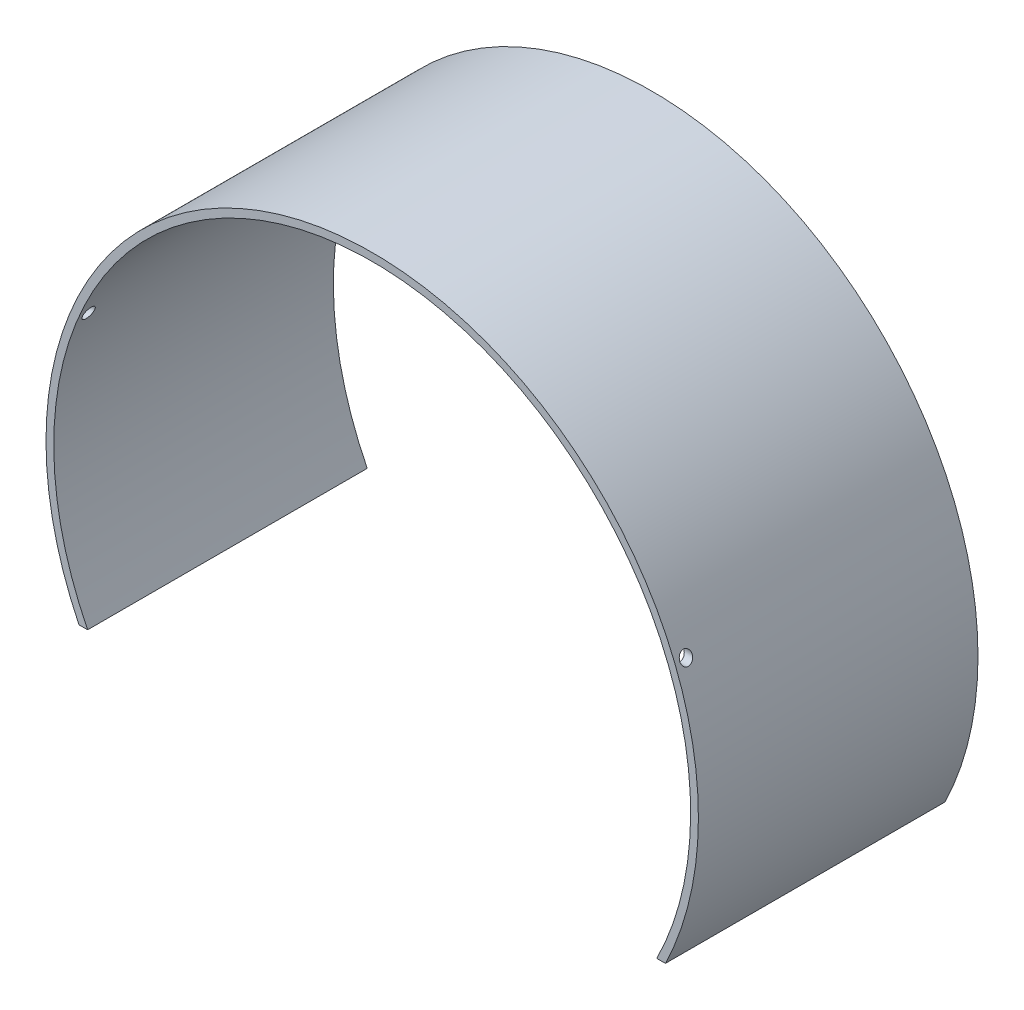
ISO-10303-21;
HEADER;
FILE_DESCRIPTION(('STEP AP214'),'2;1');
FILE_NAME('part.step','',(''),(''),'','','');
FILE_SCHEMA(('AUTOMOTIVE_DESIGN { 1 0 10303 214 1 1 1 1 }'));
ENDSEC;
DATA;
#1=APPLICATION_CONTEXT('core data for automotive mechanical design processes');
#2=APPLICATION_PROTOCOL_DEFINITION('international standard','automotive_design',2000,#1);
#3=PRODUCT_CONTEXT('',#1,'mechanical');
#4=PRODUCT('Part','Part','',(#3));
#5=PRODUCT_RELATED_PRODUCT_CATEGORY('part','',(#4));
#6=PRODUCT_DEFINITION_FORMATION('','',#4);
#7=PRODUCT_DEFINITION_CONTEXT('part definition',#1,'design');
#8=PRODUCT_DEFINITION('design','',#6,#7);
#9=PRODUCT_DEFINITION_SHAPE('','',#8);
#10=(LENGTH_UNIT() NAMED_UNIT(*) SI_UNIT(.MILLI.,.METRE.));
#11=(NAMED_UNIT(*) PLANE_ANGLE_UNIT() SI_UNIT($,.RADIAN.));
#12=(NAMED_UNIT(*) SI_UNIT($,.STERADIAN.) SOLID_ANGLE_UNIT());
#13=UNCERTAINTY_MEASURE_WITH_UNIT(LENGTH_MEASURE(1.E-05),#10,'distance_accuracy_value','');
#14=(GEOMETRIC_REPRESENTATION_CONTEXT(3) GLOBAL_UNCERTAINTY_ASSIGNED_CONTEXT((#13)) GLOBAL_UNIT_ASSIGNED_CONTEXT((#10,
#11,#12)) REPRESENTATION_CONTEXT('',''));
#15=CARTESIAN_POINT('',(0.,0.,0.));
#16=DIRECTION('',(0.,0.,1.));
#17=DIRECTION('',(1.,0.,0.));
#18=AXIS2_PLACEMENT_3D('',#15,#16,#17);
#19=CARTESIAN_POINT('',(183.196615689264,-92.0000000000001,389.75));
#20=DIRECTION('',(0.,1.,0.));
#21=DIRECTION('',(0.,0.,1.));
#22=AXIS2_PLACEMENT_3D('',#19,#20,#21);
#23=PLANE('',#22);
#24=DIRECTION('',(1.,0.,0.));
#25=VECTOR('',#24,1.);
#26=CARTESIAN_POINT('',(183.196615689264,-92.0000000000001,209.75));
#27=LINE('',#26,#25);
#28=CARTESIAN_POINT('',(183.196615689264,-92.0000000000001,209.75));
#29=VERTEX_POINT('',#28);
#30=CARTESIAN_POINT('',(188.77499834459,-92.0000000000002,209.75));
#31=VERTEX_POINT('',#30);
#32=EDGE_CURVE('E117',#29,#31,#27,.T.);
#33=ORIENTED_EDGE('',*,*,#32,.T.);
#34=DIRECTION('',(0.,0.,-1.));
#35=VECTOR('',#34,1.);
#36=CARTESIAN_POINT('',(188.77499834459,-92.0000000000002,389.75));
#37=LINE('',#36,#35);
#38=CARTESIAN_POINT('',(188.77499834459,-92.0000000000002,389.75));
#39=VERTEX_POINT('',#38);
#40=EDGE_CURVE('E11',#39,#31,#37,.T.);
#41=ORIENTED_EDGE('',*,*,#40,.F.);
#42=DIRECTION('',(1.,0.,0.));
#43=VECTOR('',#42,1.);
#44=CARTESIAN_POINT('',(183.196615689264,-92.0000000000001,389.75));
#45=LINE('',#44,#43);
#46=CARTESIAN_POINT('',(183.196615689264,-92.0000000000001,389.75));
#47=VERTEX_POINT('',#46);
#48=EDGE_CURVE('E92',#47,#39,#45,.T.);
#49=ORIENTED_EDGE('',*,*,#48,.F.);
#50=DIRECTION('',(0.,0.,-1.));
#51=VECTOR('',#50,1.);
#52=CARTESIAN_POINT('',(183.196615689264,-92.0000000000001,389.75));
#53=LINE('',#52,#51);
#54=EDGE_CURVE('E52',#47,#29,#53,.T.);
#55=ORIENTED_EDGE('',*,*,#54,.T.);
#56=EDGE_LOOP('',(#33,#41,#49,#55));
#57=FACE_BOUND('',#56,.T.);
#58=ADVANCED_FACE('F39',(#57),#23,.F.);
#59=CARTESIAN_POINT('',(0.,0.,389.75));
#60=DIRECTION('',(0.,0.,-1.));
#61=DIRECTION('',(-1.,0.,0.));
#62=AXIS2_PLACEMENT_3D('',#59,#60,#61);
#63=CYLINDRICAL_SURFACE('',#62,210.);
#64=CARTESIAN_POINT('',(-194.976921711263,77.9999999999998,378.75));
#65=CARTESIAN_POINT('',(-194.881142672388,78.2394176241366,378.750005201113));
#66=CARTESIAN_POINT('',(-194.784851609682,78.4788273444568,378.771526870039));
#67=CARTESIAN_POINT('',(-194.593935734282,78.9510299466546,378.857290996574));
#68=CARTESIAN_POINT('',(-194.499313505776,79.1838128597919,378.921594600757));
#69=CARTESIAN_POINT('',(-194.360918103973,79.5226293419747,379.049156961286));
#70=CARTESIAN_POINT('',(-194.315330547846,79.6339518551347,379.096927946436));
#71=CARTESIAN_POINT('',(-194.225708634616,79.8522885264413,379.202646509375));
#72=CARTESIAN_POINT('',(-194.181673659856,79.9593044003323,379.260589984154));
#73=CARTESIAN_POINT('',(-194.095535411539,80.1681726788096,379.386386379367));
#74=CARTESIAN_POINT('',(-194.053432280306,80.2700247030238,379.454240028367));
#75=CARTESIAN_POINT('',(-193.971574025036,80.4676326201603,379.599473979321));
#76=CARTESIAN_POINT('',(-193.931817790329,80.5633913984176,379.676849720577));
#77=CARTESIAN_POINT('',(-193.856407892729,80.7446742210524,379.837796605336));
#78=CARTESIAN_POINT('',(-193.820658568078,80.8304412494634,379.921049169495));
#79=CARTESIAN_POINT('',(-193.752088683813,80.994666776527,380.095510624695));
#80=CARTESIAN_POINT('',(-193.719266698525,81.0731288336775,380.186715599471));
#81=CARTESIAN_POINT('',(-193.656896462334,81.2219980645113,380.376546880967));
#82=CARTESIAN_POINT('',(-193.627348620902,81.2924042307452,380.475174113346));
#83=CARTESIAN_POINT('',(-193.571904072593,81.4243395714827,380.679097788599));
#84=CARTESIAN_POINT('',(-193.5460054403,81.4858734276482,380.784390671679));
#85=CARTESIAN_POINT('',(-193.500011403564,81.5950294003176,380.992586066739));
#86=CARTESIAN_POINT('',(-193.4796236238,81.6433556379105,381.095055289072));
#87=CARTESIAN_POINT('',(-193.442486580763,81.7313077430687,381.304244786342));
#88=CARTESIAN_POINT('',(-193.425735548229,81.7709378413687,381.410962964142));
#89=CARTESIAN_POINT('',(-193.396074294507,81.8410648670735,381.627855456227));
#90=CARTESIAN_POINT('',(-193.383163277795,81.8715636861862,381.738029049428));
#91=CARTESIAN_POINT('',(-193.361347952578,81.9230730794341,381.960960763958));
#92=CARTESIAN_POINT('',(-193.352443425654,81.9440841708041,382.073718744042));
#93=CARTESIAN_POINT('',(-193.339254445418,81.975197182781,382.292680466997));
#94=CARTESIAN_POINT('',(-193.334683438522,81.9859758059851,382.398771376333));
#95=CARTESIAN_POINT('',(-193.329148371212,81.9990270760377,382.611607367368));
#96=CARTESIAN_POINT('',(-193.328185515917,82.0012968809479,382.718352655708));
#97=CARTESIAN_POINT('',(-193.329881719032,81.9972977543902,382.931593544981));
#98=CARTESIAN_POINT('',(-193.332538739888,81.9910336264937,383.038089252607));
#99=CARTESIAN_POINT('',(-193.341440181146,81.970041099729,383.250129756368));
#100=CARTESIAN_POINT('',(-193.347685923304,81.9553095822486,383.355674187584));
#101=CARTESIAN_POINT('',(-193.363469731107,81.9180625461989,383.562077684767));
#102=CARTESIAN_POINT('',(-193.372911144231,81.8957755146518,383.662985337062));
#103=CARTESIAN_POINT('',(-193.39500971329,81.8435764919634,383.862460423829));
#104=CARTESIAN_POINT('',(-193.407668007906,81.8136618008432,383.961027016097));
#105=CARTESIAN_POINT('',(-193.450273896472,81.7128931446686,384.252163652002));
#106=CARTESIAN_POINT('',(-193.484867806969,81.6309785649149,384.44036750629));
#107=CARTESIAN_POINT('',(-193.566146255149,81.4380636154416,384.805120161454));
#108=CARTESIAN_POINT('',(-193.613137588048,81.3263242134224,384.981205115071));
#109=CARTESIAN_POINT('',(-193.716988481702,81.0786431946026,385.312164524876));
#110=CARTESIAN_POINT('',(-193.773850617128,80.9426952630776,385.467033428224));
#111=CARTESIAN_POINT('',(-193.899633032345,80.6409368791542,385.762123137858));
#112=CARTESIAN_POINT('',(-193.969102355083,80.4737453411596,385.900695624245));
#113=CARTESIAN_POINT('',(-194.114947661446,80.1213047780078,386.14800763883));
#114=CARTESIAN_POINT('',(-194.191325972669,79.9360496656895,386.256737062935));
#115=CARTESIAN_POINT('',(-194.354826233593,79.5377345074466,386.449723942606));
#116=CARTESIAN_POINT('',(-194.442323928921,79.3236311946809,386.531512760198));
#117=CARTESIAN_POINT('',(-194.620364250769,78.8858017302189,386.657336709786));
#118=CARTESIAN_POINT('',(-194.710907803923,78.6620726442141,386.701360242593));
#119=CARTESIAN_POINT('',(-194.897539667198,78.1985591915143,386.752221195849));
#120=CARTESIAN_POINT('',(-194.993665796349,77.9585556029542,386.756946523904));
#121=CARTESIAN_POINT('',(-195.184009199804,77.4807635367216,386.723381600682));
#122=CARTESIAN_POINT('',(-195.278226201372,77.2429753781281,386.685085246867));
#123=CARTESIAN_POINT('',(-195.462923022818,76.7744077564935,386.565349224868));
#124=CARTESIAN_POINT('',(-195.553363286069,76.5437070845793,386.48353780504));
#125=CARTESIAN_POINT('',(-195.726910570802,76.0988403603978,386.277833439571));
#126=CARTESIAN_POINT('',(-195.810018778985,75.8846716331198,386.153947319568));
#127=CARTESIAN_POINT('',(-195.963138927896,75.4883542471023,385.872246313331));
#128=CARTESIAN_POINT('',(-196.033534956521,75.3052831559748,385.715941374065));
#129=CARTESIAN_POINT('',(-196.162654248222,74.968297932966,385.370482035907));
#130=CARTESIAN_POINT('',(-196.221382519999,74.8143712913772,385.181341798082));
#131=CARTESIAN_POINT('',(-196.321489486172,74.5512663872162,384.789172710081));
#132=CARTESIAN_POINT('',(-196.363766055537,74.4397832895196,384.587919662631));
#133=CARTESIAN_POINT('',(-196.434690713109,74.252423501199,384.167254444403));
#134=CARTESIAN_POINT('',(-196.463344742107,74.1765312895803,383.947850238447));
#135=CARTESIAN_POINT('',(-196.504568867916,74.0672506562282,383.512070699953));
#136=CARTESIAN_POINT('',(-196.518037526864,74.0314883468818,383.296373396423));
#137=CARTESIAN_POINT('',(-196.53154666379,73.9956185212156,382.861635055153));
#138=CARTESIAN_POINT('',(-196.531590299738,73.9955026197822,382.642594815895));
#139=CARTESIAN_POINT('',(-196.518471572112,74.03033588563,382.214912549003));
#140=CARTESIAN_POINT('',(-196.505736743506,74.064149845954,382.006163474696));
#141=CARTESIAN_POINT('',(-196.468139753065,74.1638245426943,381.59762506648));
#142=CARTESIAN_POINT('',(-196.443277646107,74.2296851341011,381.397835692033));
#143=CARTESIAN_POINT('',(-196.381982743873,74.3916955594421,381.010889445688));
#144=CARTESIAN_POINT('',(-196.345455471559,74.4880926574939,380.823851405901));
#145=CARTESIAN_POINT('',(-196.262027799062,74.7076314098016,380.468794432983));
#146=CARTESIAN_POINT('',(-196.215126165889,74.8307762429886,380.300777764129));
#147=CARTESIAN_POINT('',(-196.11003520958,75.1057696227136,379.98054381049));
#148=CARTESIAN_POINT('',(-196.051443449062,75.2586341905078,379.829332456599));
#149=CARTESIAN_POINT('',(-195.926027635156,75.5845365611036,379.554532150932));
#150=CARTESIAN_POINT('',(-195.859199323463,75.7575847963796,379.430957581105));
#151=CARTESIAN_POINT('',(-195.714520642496,76.1306042804032,379.206594285297));
#152=CARTESIAN_POINT('',(-195.636238320565,76.3315903175498,379.107774247862));
#153=CARTESIAN_POINT('',(-195.474382967604,76.7451287346369,378.94545272178));
#154=CARTESIAN_POINT('',(-195.390814529047,76.9576710527619,378.881921032269));
#155=CARTESIAN_POINT('',(-195.251823299262,77.3094241330047,378.80760010628));
#156=CARTESIAN_POINT('',(-195.197362204936,77.4468322888159,378.786004982189));
#157=CARTESIAN_POINT('',(-195.087631844921,77.7228278239254,378.757203222643));
#158=CARTESIAN_POINT('',(-195.032362556685,77.8614152360773,378.749996989382));
#159=CARTESIAN_POINT('',(-194.976921711263,77.9999999999998,378.75));
#160=B_SPLINE_CURVE_WITH_KNOTS('',3,(#64,#65,#66,#67,#68,#69,#70,#71,#72,#73,#74,#75,#76,#77,
#78,#79,#80,#81,#82,#83,#84,#85,#86,#87,#88,#89,#90,#91,#92,#93,#94,#95,#96,#97,#98,#99,#100,
#101,#102,#103,#104,#105,#106,#107,#108,#109,#110,#111,#112,#113,#114,#115,#116,#117,#118,#119,
#120,#121,#122,#123,#124,#125,#126,#127,#128,#129,#130,#131,#132,#133,#134,#135,#136,#137,#138,
#139,#140,#141,#142,#143,#144,#145,#146,#147,#148,#149,#150,#151,#152,#153,#154,#155,#156,#157,
#158,#159),.UNSPECIFIED.,.T.,.F.,(4,2,2,2,2,2,2,2,2,2,2,2,2,2,2,2,2,2,2,2,2,2,2,2,2,2,2,2,2,2,2,
2,2,2,2,2,2,2,2,2,2,2,2,2,2,2,2,4),(0.,0.773084114651815,1.54727554920158,1.93517625847403,
2.32292086836418,2.71069399835494,3.09828211823903,3.47207342220481,3.84568167651744,
4.21933660239431,4.59279363407431,4.9376824887526,5.28240317865652,5.62705240400698,
5.97168283812283,6.29149272007331,6.61140940874959,6.93114609742438,7.25100062339306,
7.56193692327922,7.87298343910647,8.49448136285373,9.13309882680567,9.77188311693246,
10.4529533314922,11.1342538552361,11.8670128850764,12.5999968932516,13.3721365655025,
14.1443857780187,14.9233408954379,15.7021697058642,16.4506546708181,17.1988176306998,
17.8969258808102,18.5947294059009,19.2486271155422,19.9023710085427,20.5349481371912,
21.167522403486,21.8053557147744,22.4432648731834,23.1089383488064,23.7749574333933,
24.4836747468968,25.1917845798408,25.6392649411511,26.0867578101809),.UNSPECIFIED.);
#161=CARTESIAN_POINT('',(-194.976921711263,77.9999999999998,378.75));
#162=VERTEX_POINT('',#161);
#163=EDGE_CURVE('E106',#162,#162,#160,.T.);
#164=ORIENTED_EDGE('',*,*,#163,.T.);
#165=EDGE_LOOP('',(#164));
#166=FACE_BOUND('',#165,.T.);
#167=CARTESIAN_POINT('',(194.976921711263,77.9999999999998,378.75));
#168=CARTESIAN_POINT('',(195.071739103529,77.7629827940224,378.750008341797));
#169=CARTESIAN_POINT('',(195.16619155225,77.5256152307878,378.771111025675));
#170=CARTESIAN_POINT('',(195.351746518049,77.0568548158801,378.855477450002));
#171=CARTESIAN_POINT('',(195.442844703569,76.825469797184,378.918793818411));
#172=CARTESIAN_POINT('',(195.619173589421,76.375371743191,379.086894209028));
#173=CARTESIAN_POINT('',(195.70439576273,76.1566771937005,379.191737065146));
#174=CARTESIAN_POINT('',(195.866188657395,75.7395947053984,379.440991591055));
#175=CARTESIAN_POINT('',(195.942763242787,75.5411977007084,379.585385488499));
#176=CARTESIAN_POINT('',(196.081725138623,75.179738369808,379.90365867604));
#177=CARTESIAN_POINT('',(196.144572883844,75.0155428097419,380.076046762991));
#178=CARTESIAN_POINT('',(196.257787676374,74.7188467834507,380.449807452451));
#179=CARTESIAN_POINT('',(196.308159766375,74.5863335119196,380.6511682919));
#180=CARTESIAN_POINT('',(196.391508865999,74.366579571367,381.062165904988));
#181=CARTESIAN_POINT('',(196.425444857934,74.2768497525348,381.270277983162));
#182=CARTESIAN_POINT('',(196.479570463859,74.133557345892,381.700279462973));
#183=CARTESIAN_POINT('',(196.499765516395,74.0799804491323,381.922163375846));
#184=CARTESIAN_POINT('',(196.524904774281,74.0132622995728,382.359907775281));
#185=CARTESIAN_POINT('',(196.530643812969,73.9980137517791,382.575403752064));
#186=CARTESIAN_POINT('',(196.528992239273,74.0024001214686,383.00597074134));
#187=CARTESIAN_POINT('',(196.521603860048,74.022029105793,383.221041819884));
#188=CARTESIAN_POINT('',(196.49425912081,74.0945852487143,383.639932279777));
#189=CARTESIAN_POINT('',(196.474571162513,74.1468012677481,383.843893307963));
#190=CARTESIAN_POINT('',(196.423530560797,74.2819077554937,384.239815837077));
#191=CARTESIAN_POINT('',(196.392177367368,74.3647996705602,384.431776771709));
#192=CARTESIAN_POINT('',(196.318074771379,74.5602078572997,384.802456461768));
#193=CARTESIAN_POINT('',(196.275116174077,74.6732674065914,384.980846258714));
#194=CARTESIAN_POINT('',(196.179387073392,74.9244026314206,385.316045554657));
#195=CARTESIAN_POINT('',(196.126614603631,75.0624833202313,385.472850717826));
#196=CARTESIAN_POINT('',(196.009777439476,75.3670686141398,385.769119323256));
#197=CARTESIAN_POINT('',(195.945272987463,75.5346663972325,385.907284179418));
#198=CARTESIAN_POINT('',(195.808770974093,75.8878188543834,386.153688214243));
#199=CARTESIAN_POINT('',(195.736771269916,76.0733786625389,386.261918802474));
#200=CARTESIAN_POINT('',(195.582144335651,76.4700789536334,386.452823593028));
#201=CARTESIAN_POINT('',(195.499129829853,76.6820989463912,386.533357197598));
#202=CARTESIAN_POINT('',(195.328760818731,77.115039815053,386.65737764305));
#203=CARTESIAN_POINT('',(195.241405019085,77.3359633417179,386.700853364439));
#204=CARTESIAN_POINT('',(195.059442183209,77.7938173232741,386.751685695812));
#205=CARTESIAN_POINT('',(194.964705526998,78.030942794384,386.756844064007));
#206=CARTESIAN_POINT('',(194.775336322718,78.5024395207821,386.725355089931));
#207=CARTESIAN_POINT('',(194.680703801874,78.7368101638666,386.688698626226));
#208=CARTESIAN_POINT('',(194.491883716667,79.2020930614317,386.572788430876));
#209=CARTESIAN_POINT('',(194.397760808013,79.4327888852944,386.492537840921));
#210=CARTESIAN_POINT('',(194.261067346302,79.7662354986406,386.341015279634));
#211=CARTESIAN_POINT('',(194.216226607565,79.8753445501149,386.285275208689));
#212=CARTESIAN_POINT('',(194.128412750753,80.088529751882,386.163660000444));
#213=CARTESIAN_POINT('',(194.085438792273,80.1926081693413,386.097789485693));
#214=CARTESIAN_POINT('',(194.002816262791,80.3922799585153,385.95803313213));
#215=CARTESIAN_POINT('',(193.963111116386,80.4880212433744,385.884391754939));
#216=CARTESIAN_POINT('',(193.886252889075,80.6729878145424,385.728216977088));
#217=CARTESIAN_POINT('',(193.84909860609,80.7622161713006,385.645687812503));
#218=CARTESIAN_POINT('',(193.777707723683,80.9333589525278,385.472178687309));
#219=CARTESIAN_POINT('',(193.743471552387,81.0152723038723,385.381197490752));
#220=CARTESIAN_POINT('',(193.678329423984,81.170880397976,385.191426559618));
#221=CARTESIAN_POINT('',(193.647421729163,81.2445794299367,385.092640946692));
#222=CARTESIAN_POINT('',(193.591306649549,81.3781965578633,384.894998816619));
#223=CARTESIAN_POINT('',(193.565853092079,81.4387146644218,384.796617537115));
#224=CARTESIAN_POINT('',(193.518451717335,81.5512880051096,384.594380109412));
#225=CARTESIAN_POINT('',(193.496502179255,81.6033473934989,384.490526682094));
#226=CARTESIAN_POINT('',(193.456370655592,81.6984413447288,384.278094009294));
#227=CARTESIAN_POINT('',(193.438187792085,81.741478010583,384.169515872186));
#228=CARTESIAN_POINT('',(193.405822325878,81.8180274785651,383.948475105631));
#229=CARTESIAN_POINT('',(193.39163944992,81.8515409312698,383.836012742122));
#230=CARTESIAN_POINT('',(193.368419480042,81.9063804729494,383.617123312726));
#231=CARTESIAN_POINT('',(193.35906534451,81.9284579288671,383.510917477317));
#232=CARTESIAN_POINT('',(193.34402707539,81.9639406529148,383.296769269058));
#233=CARTESIAN_POINT('',(193.338344173848,81.9773430097352,383.188826325686));
#234=CARTESIAN_POINT('',(193.330727150222,81.9953049583394,382.972145974974));
#235=CARTESIAN_POINT('',(193.328790603323,81.9998702698721,382.863409127271));
#236=CARTESIAN_POINT('',(193.328682841027,82.0001243326725,382.64588397182));
#237=CARTESIAN_POINT('',(193.330512989353,81.9958098690382,382.537095659697));
#238=CARTESIAN_POINT('',(193.337754846456,81.9787328164936,382.325179654904));
#239=CARTESIAN_POINT('',(193.343003595292,81.9663546099172,382.222015445859));
#240=CARTESIAN_POINT('',(193.356857883019,81.9336671492283,382.01716885844));
#241=CARTESIAN_POINT('',(193.365464603114,81.9133551042965,381.915487014575));
#242=CARTESIAN_POINT('',(193.396190126523,81.8407996795769,381.613814149499));
#243=CARTESIAN_POINT('',(193.423222051323,81.7769187895505,381.416974958919));
#244=CARTESIAN_POINT('',(193.489597684224,81.6197455687946,381.03517936177));
#245=CARTESIAN_POINT('',(193.529075034239,81.5261338967581,380.850379539411));
#246=CARTESIAN_POINT('',(193.61870763147,81.3130333114624,380.499223865328));
#247=CARTESIAN_POINT('',(193.668864711779,81.1935399557529,380.332871187377));
#248=CARTESIAN_POINT('',(193.781238316366,80.9249898972076,380.013127841003));
#249=CARTESIAN_POINT('',(193.84397791136,80.7746397289685,379.861009673136));
#250=CARTESIAN_POINT('',(193.977382653513,80.453745766879,379.583911041884));
#251=CARTESIAN_POINT('',(194.048052296354,80.2831905153314,379.458946091203));
#252=CARTESIAN_POINT('',(194.200893980938,79.9128017115892,379.229746582891));
#253=CARTESIAN_POINT('',(194.283532426229,79.7117262863388,379.12783192862));
#254=CARTESIAN_POINT('',(194.453119458227,79.2971271836574,378.959557137676));
#255=CARTESIAN_POINT('',(194.540064489579,79.0836137497545,378.893168189704));
#256=CARTESIAN_POINT('',(194.685682117936,78.7242585206045,378.813410363523));
#257=CARTESIAN_POINT('',(194.74379139674,78.5804047818664,378.789658712073));
#258=CARTESIAN_POINT('',(194.860286921548,78.2910781516462,378.757950609829));
#259=CARTESIAN_POINT('',(194.918673179992,78.145605187027,378.74999487544));
#260=CARTESIAN_POINT('',(194.976921711263,77.9999999999998,378.75));
#261=B_SPLINE_CURVE_WITH_KNOTS('',3,(#167,#168,#169,#170,#171,#172,#173,#174,#175,#176,#177,
#178,#179,#180,#181,#182,#183,#184,#185,#186,#187,#188,#189,#190,#191,#192,#193,#194,#195,#196,
#197,#198,#199,#200,#201,#202,#203,#204,#205,#206,#207,#208,#209,#210,#211,#212,#213,#214,#215,
#216,#217,#218,#219,#220,#221,#222,#223,#224,#225,#226,#227,#228,#229,#230,#231,#232,#233,#234,
#235,#236,#237,#238,#239,#240,#241,#242,#243,#244,#245,#246,#247,#248,#249,#250,#251,#252,#253,
#254,#255,#256,#257,#258,#259,#260),.UNSPECIFIED.,.T.,.F.,(4,2,2,2,2,2,2,2,2,2,2,2,2,2,2,2,2,2,
2,2,2,2,2,2,2,2,2,2,2,2,2,2,2,2,2,2,2,2,2,2,2,2,2,2,2,2,4),(0.,0.765285118381461,
1.53152610918468,2.29885660075159,3.06584285476259,3.80065060281653,4.53516085325703,
5.21909227858946,5.9027528519847,6.54791160238833,7.192960612722,7.82440269793064,
8.45587455914713,9.09959129078928,9.74343714138248,10.4202408563119,11.0972385969497,
11.8186191807234,12.540216143962,13.3029125076887,14.0657752768401,14.8468652767005,
15.2378647029486,15.6286862415268,16.0096368444826,16.3904066766361,16.7712322769589,
17.1518580838826,17.5062199615914,17.8604072749853,18.214511942488,18.5685924135603,
18.8948173353297,19.2211516794854,19.5472747340724,19.873515881524,20.1852431009891,
20.4970800730003,21.1200971629641,21.7500463260834,22.3801037023578,23.0459397294931,
23.7121551561115,24.4293812281314,25.146024745866,25.6161358879329,26.0862683508127),.UNSPECIFIED.);
#262=CARTESIAN_POINT('',(194.976921711263,77.9999999999998,378.75));
#263=VERTEX_POINT('',#262);
#264=EDGE_CURVE('E109',#263,#263,#261,.T.);
#265=ORIENTED_EDGE('',*,*,#264,.T.);
#266=EDGE_LOOP('',(#265));
#267=FACE_BOUND('',#266,.T.);
#268=CARTESIAN_POINT('',(0.,0.,209.75));
#269=DIRECTION('',(0.,0.,1.));
#270=DIRECTION('',(1.,0.,0.));
#271=AXIS2_PLACEMENT_3D('',#268,#269,#270);
#272=CIRCLE('',#271,210.);
#273=CARTESIAN_POINT('',(-188.77499834459,-92.0000000000002,209.75));
#274=VERTEX_POINT('',#273);
#275=EDGE_CURVE('E72',#31,#274,#272,.T.);
#276=ORIENTED_EDGE('',*,*,#275,.T.);
#277=DIRECTION('',(0.,0.,1.));
#278=VECTOR('',#277,1.);
#279=CARTESIAN_POINT('',(-188.77499834459,-92.0000000000002,-158.086920387283));
#280=LINE('',#279,#278);
#281=CARTESIAN_POINT('',(-188.77499834459,-92.0000000000002,389.75));
#282=VERTEX_POINT('',#281);
#283=EDGE_CURVE('E98',#274,#282,#280,.T.);
#284=ORIENTED_EDGE('',*,*,#283,.T.);
#285=CARTESIAN_POINT('',(0.,0.,389.75));
#286=DIRECTION('',(0.,0.,1.));
#287=DIRECTION('',(1.,0.,0.));
#288=AXIS2_PLACEMENT_3D('',#285,#286,#287);
#289=CIRCLE('',#288,210.);
#290=EDGE_CURVE('E86',#39,#282,#289,.T.);
#291=ORIENTED_EDGE('',*,*,#290,.F.);
#292=ORIENTED_EDGE('',*,*,#40,.T.);
#293=EDGE_LOOP('',(#276,#284,#291,#292));
#294=FACE_BOUND('',#293,.T.);
#295=ADVANCED_FACE('F99',(#166,#267,#294),#63,.T.);
#296=CARTESIAN_POINT('',(0.,0.,389.75));
#297=DIRECTION('',(0.,0.,-1.));
#298=DIRECTION('',(-1.,0.,0.));
#299=AXIS2_PLACEMENT_3D('',#296,#297,#298);
#300=CYLINDRICAL_SURFACE('',#299,205.);
#301=CARTESIAN_POINT('',(-189.581117203164,77.9999999999998,378.75));
#302=CARTESIAN_POINT('',(-189.482258275586,78.2402776432523,378.750005095625));
#303=CARTESIAN_POINT('',(-189.382868513343,78.4805380989971,378.771680496129));
#304=CARTESIAN_POINT('',(-189.185801531231,78.9544073891078,378.85806337717));
#305=CARTESIAN_POINT('',(-189.088127009669,79.1880060508748,378.92283334079));
#306=CARTESIAN_POINT('',(-188.945262669483,79.5280014311712,379.051355851264));
#307=CARTESIAN_POINT('',(-188.898200304387,79.6397144080826,379.099493582761));
#308=CARTESIAN_POINT('',(-188.805681363948,79.8588052487141,379.206039082778));
#309=CARTESIAN_POINT('',(-188.760224145216,79.9661848518999,379.264442679012));
#310=CARTESIAN_POINT('',(-188.671309536296,80.1757440200394,379.391258582565));
#311=CARTESIAN_POINT('',(-188.627852288773,80.277923214085,379.45967160244));
#312=CARTESIAN_POINT('',(-188.543372476279,80.4761349282725,379.606128277423));
#313=CARTESIAN_POINT('',(-188.502348742339,80.572170401396,379.684167252186));
#314=CARTESIAN_POINT('',(-188.424642138186,80.7537220024057,379.846335944912));
#315=CARTESIAN_POINT('',(-188.387853732309,80.8394987193874,379.930123274461));
#316=CARTESIAN_POINT('',(-188.317308740623,81.0036987473082,380.105716829394));
#317=CARTESIAN_POINT('',(-188.283550654922,81.0821256969537,380.197519042837));
#318=CARTESIAN_POINT('',(-188.219428899592,81.2308632679018,380.388605670686));
#319=CARTESIAN_POINT('',(-188.18906557086,81.3011730741158,380.487890834845));
#320=CARTESIAN_POINT('',(-188.13212894761,81.4328386019724,380.693187221682));
#321=CARTESIAN_POINT('',(-188.105553612724,81.4941991444732,380.799194778598));
#322=CARTESIAN_POINT('',(-188.058514629355,81.6026855224331,381.008336382901));
#323=CARTESIAN_POINT('',(-188.037730591799,81.6505610772606,381.111010009519));
#324=CARTESIAN_POINT('',(-187.999910987584,81.7376028619191,381.320597314638));
#325=CARTESIAN_POINT('',(-187.982873568176,81.7767733965923,381.42750886642));
#326=CARTESIAN_POINT('',(-187.952757788695,81.8459666996774,381.644769274261));
#327=CARTESIAN_POINT('',(-187.93967851329,81.875991583056,381.7551173291));
#328=CARTESIAN_POINT('',(-187.91765055278,81.9265364417624,381.978372998636));
#329=CARTESIAN_POINT('',(-187.908701628343,81.9470569678175,382.09128046463));
#330=CARTESIAN_POINT('',(-187.895575182881,81.9771497022216,382.310073178555));
#331=CARTESIAN_POINT('',(-187.891087622101,81.9874333952941,382.415842620941));
#332=CARTESIAN_POINT('',(-187.885799684895,81.9995507402416,382.627994667766));
#333=CARTESIAN_POINT('',(-187.885000535801,82.0013815794024,382.734377464513));
#334=CARTESIAN_POINT('',(-187.887102465765,81.9965653773232,382.946852999172));
#335=CARTESIAN_POINT('',(-187.890001440872,81.9899231566074,383.05294586763));
#336=CARTESIAN_POINT('',(-187.899461725554,81.9682403275319,383.264142843768));
#337=CARTESIAN_POINT('',(-187.906024385391,81.9531966227774,383.369246572368));
#338=CARTESIAN_POINT('',(-187.922495273811,81.9154209070356,383.574660514562));
#339=CARTESIAN_POINT('',(-187.932302030622,81.8929220528747,383.67502171303));
#340=CARTESIAN_POINT('',(-187.955186478404,81.8403854394414,383.873381382478));
#341=CARTESIAN_POINT('',(-187.968265325526,81.8103450154373,383.971379004872));
#342=CARTESIAN_POINT('',(-188.012206996603,81.7093352527136,384.260788164673));
#343=CARTESIAN_POINT('',(-188.04779076782,81.6274412466518,384.447809989272));
#344=CARTESIAN_POINT('',(-188.131313579995,81.4347599443676,384.810561238185));
#345=CARTESIAN_POINT('',(-188.179587246713,81.3231889552417,384.985792356867));
#346=CARTESIAN_POINT('',(-188.28615296498,81.0761535522663,385.315084175137));
#347=CARTESIAN_POINT('',(-188.344447750854,80.9406826169046,385.469139075963));
#348=CARTESIAN_POINT('',(-188.473529490241,80.6396755371505,385.763208150936));
#349=CARTESIAN_POINT('',(-188.544904788738,80.4726998203382,385.901488399007));
#350=CARTESIAN_POINT('',(-188.694683571214,80.1208647270175,386.148256998852));
#351=CARTESIAN_POINT('',(-188.773089521107,79.9359990740231,386.256734843166));
#352=CARTESIAN_POINT('',(-188.941195026617,79.5378843913732,386.449680108022));
#353=CARTESIAN_POINT('',(-189.03129693414,79.3235472329166,386.531555049386));
#354=CARTESIAN_POINT('',(-189.214607311942,78.8852891862046,386.657465804867));
#355=CARTESIAN_POINT('',(-189.307816770114,78.6613652437493,386.701489464556));
#356=CARTESIAN_POINT('',(-189.500182981247,78.1968494079193,386.752354124647));
#357=CARTESIAN_POINT('',(-189.599379892491,77.9560274317009,386.756969364242));
#358=CARTESIAN_POINT('',(-189.795793772174,77.4766017037827,386.722885916754));
#359=CARTESIAN_POINT('',(-189.893010440793,77.2379982909153,386.684180719612));
#360=CARTESIAN_POINT('',(-190.083605192675,76.76775347441,386.563269083927));
#361=CARTESIAN_POINT('',(-190.176940845943,76.5361940722029,386.480674206701));
#362=CARTESIAN_POINT('',(-190.356011642501,76.0897279411543,386.272986782963));
#363=CARTESIAN_POINT('',(-190.441748095957,75.8748183425551,386.147901580181));
#364=CARTESIAN_POINT('',(-190.599456208071,75.4777524823422,385.863742394973));
#365=CARTESIAN_POINT('',(-190.671849807899,75.2946107618682,385.706283484147));
#366=CARTESIAN_POINT('',(-190.804545271061,74.95771034359,385.358263882436));
#367=CARTESIAN_POINT('',(-190.86485269591,74.8039381327927,385.16771849215));
#368=CARTESIAN_POINT('',(-190.967303340688,74.5419848397365,384.773402439992));
#369=CARTESIAN_POINT('',(-191.010428825649,74.4313503264306,384.571517168621));
#370=CARTESIAN_POINT('',(-191.082631019937,74.2457952540757,384.149632193801));
#371=CARTESIAN_POINT('',(-191.111714230155,74.170858169068,383.929640927867));
#372=CARTESIAN_POINT('',(-191.15325263729,74.0637367123581,383.493563253258));
#373=CARTESIAN_POINT('',(-191.166680441437,74.029052347329,383.278181037301));
#374=CARTESIAN_POINT('',(-191.179787213024,73.9951979373714,382.844246866389));
#375=CARTESIAN_POINT('',(-191.179469546334,73.9960191981399,382.625695700521));
#376=CARTESIAN_POINT('',(-191.165347196713,74.0324953275928,382.199418268312));
#377=CARTESIAN_POINT('',(-191.151996242536,74.0669783268642,381.99157507992));
#378=CARTESIAN_POINT('',(-191.112940360489,74.1676945536356,381.584965867422));
#379=CARTESIAN_POINT('',(-191.087235452461,74.2339277301409,381.386199828736));
#380=CARTESIAN_POINT('',(-191.024026222946,74.3964315528062,381.001180763331));
#381=CARTESIAN_POINT('',(-190.986414551838,74.4929754074905,380.815061067414));
#382=CARTESIAN_POINT('',(-190.900645664798,74.7124978136653,380.46185879391));
#383=CARTESIAN_POINT('',(-190.852487105323,74.8354797330046,380.294778645855));
#384=CARTESIAN_POINT('',(-190.744556277344,75.1101654877132,379.975988348456));
#385=CARTESIAN_POINT('',(-190.684350869763,75.2629322691359,379.8253422404));
#386=CARTESIAN_POINT('',(-190.555565269532,75.5884062800617,379.551644995981));
#387=CARTESIAN_POINT('',(-190.486980636232,75.7611240801302,379.428608590474));
#388=CARTESIAN_POINT('',(-190.338329729906,76.133849998115,379.204881078127));
#389=CARTESIAN_POINT('',(-190.257800974509,76.3349131962451,379.106258170372));
#390=CARTESIAN_POINT('',(-190.091349267774,76.748475550428,378.944354011882));
#391=CARTESIAN_POINT('',(-190.00543094841,76.9609648646585,378.881042863701));
#392=CARTESIAN_POINT('',(-189.862732749149,77.312122496262,378.807147135616));
#393=CARTESIAN_POINT('',(-189.806935727393,77.4490102833277,378.785720704029));
#394=CARTESIAN_POINT('',(-189.694523279666,77.7239339160857,378.757145471361));
#395=CARTESIAN_POINT('',(-189.637907830669,77.8619697940312,378.749997072761));
#396=CARTESIAN_POINT('',(-189.581117203164,77.9999999999998,378.75));
#397=B_SPLINE_CURVE_WITH_KNOTS('',3,(#301,#302,#303,#304,#305,#306,#307,#308,#309,#310,#311,
#312,#313,#314,#315,#316,#317,#318,#319,#320,#321,#322,#323,#324,#325,#326,#327,#328,#329,#330,
#331,#332,#333,#334,#335,#336,#337,#338,#339,#340,#341,#342,#343,#344,#345,#346,#347,#348,#349,
#350,#351,#352,#353,#354,#355,#356,#357,#358,#359,#360,#361,#362,#363,#364,#365,#366,#367,#368,
#369,#370,#371,#372,#373,#374,#375,#376,#377,#378,#379,#380,#381,#382,#383,#384,#385,#386,#387,
#388,#389,#390,#391,#392,#393,#394,#395,#396),.UNSPECIFIED.,.T.,.F.,(4,2,2,2,2,2,2,2,2,2,2,2,2,
2,2,2,2,2,2,2,2,2,2,2,2,2,2,2,2,2,2,2,2,2,2,2,2,2,2,2,2,2,2,2,2,2,2,4),(0.,0.778949189872491,
1.55903025153105,1.94991559942465,2.34064244825754,2.73139712591438,3.12196255376593,
3.49774334219784,3.87333709607884,4.24896853272389,4.62439686797845,4.96947703196792,
5.31438616387476,5.65921547357398,6.00402479973723,6.32271931803136,6.64151987530696,
6.96013914027089,7.2788759109861,7.58846079606999,7.89815522394765,8.51695734551675,
9.15408125397712,9.79137928232314,10.4732202420357,11.1553012913909,11.8915754336502,
12.6280859127626,13.4059366938608,14.183904383617,14.9688749208875,15.7537098583491,
16.5061669157281,17.2582769270757,17.9572516303257,18.6559024312522,19.3083414659943,
19.9606207381529,20.590973461521,21.2213251724656,21.8575301511561,22.4938162217542,
23.1594434314159,23.8254249393054,24.5363483473597,25.2466689198558,25.694132466459,
26.141608626379),.UNSPECIFIED.);
#398=CARTESIAN_POINT('',(-189.581117203164,77.9999999999998,378.75));
#399=VERTEX_POINT('',#398);
#400=EDGE_CURVE('E42',#399,#399,#397,.T.);
#401=ORIENTED_EDGE('',*,*,#400,.F.);
#402=EDGE_LOOP('',(#401));
#403=FACE_BOUND('',#402,.T.);
#404=CARTESIAN_POINT('',(189.581117203165,77.9999999999998,378.75));
#405=CARTESIAN_POINT('',(189.678928006535,77.7622663802999,378.750008246516));
#406=CARTESIAN_POINT('',(189.776361479812,77.524169523992,378.771237491761));
#407=CARTESIAN_POINT('',(189.967774596488,77.0539373219604,378.856137783238));
#408=CARTESIAN_POINT('',(190.061749733827,76.8218098649423,378.919862267267));
#409=CARTESIAN_POINT('',(190.243652574616,76.3702296641734,379.089119241938));
#410=CARTESIAN_POINT('',(190.331570786684,76.1507968958896,379.194715673289));
#411=CARTESIAN_POINT('',(190.498453639081,75.73235719249,379.445868915794));
#412=CARTESIAN_POINT('',(190.577422413021,75.5333408314021,379.591407171257));
#413=CARTESIAN_POINT('',(190.720468036848,75.1713996652757,379.911898104867));
#414=CARTESIAN_POINT('',(190.785051692269,75.0072617363569,380.085250981612));
#415=CARTESIAN_POINT('',(190.901309929465,74.710877952996,380.461141130949));
#416=CARTESIAN_POINT('',(190.952990136731,74.5786182015629,380.663665624709));
#417=CARTESIAN_POINT('',(191.038192981649,74.360080889559,381.076236746108));
#418=CARTESIAN_POINT('',(191.072761798821,74.2711612919871,381.284668650928));
#419=CARTESIAN_POINT('',(191.127756284271,74.1295259610134,381.715242185925));
#420=CARTESIAN_POINT('',(191.148187867902,74.0767950854682,381.937378039618));
#421=CARTESIAN_POINT('',(191.173339613425,74.0118595434171,382.374854340979));
#422=CARTESIAN_POINT('',(191.178917528145,73.9974424830528,382.589819681966));
#423=CARTESIAN_POINT('',(191.176650193893,74.0033001912224,383.019186028478));
#424=CARTESIAN_POINT('',(191.168807307783,74.0235688530014,383.233587126687));
#425=CARTESIAN_POINT('',(191.140303554934,74.0971378492237,383.650883180282));
#426=CARTESIAN_POINT('',(191.119925626579,74.1497090298886,383.853927041322));
#427=CARTESIAN_POINT('',(191.067293348144,74.2852250404077,384.247952563942));
#428=CARTESIAN_POINT('',(191.035038384118,74.3681714404188,384.438933601371));
#429=CARTESIAN_POINT('',(190.958885344235,74.5634982512781,384.807895093022));
#430=CARTESIAN_POINT('',(190.914759029951,74.6764550452135,384.985522475547));
#431=CARTESIAN_POINT('',(190.816526839363,74.9271057031147,385.319221525132));
#432=CARTESIAN_POINT('',(190.762418865621,75.0648047659919,385.475288649677));
#433=CARTESIAN_POINT('',(190.642545399813,75.368746347542,385.770559426364));
#434=CARTESIAN_POINT('',(190.57630801423,75.5361290736083,385.908396393932));
#435=CARTESIAN_POINT('',(190.436199825351,75.8886670127736,386.15418763773));
#436=CARTESIAN_POINT('',(190.362326747131,76.0738275212836,386.262132972814));
#437=CARTESIAN_POINT('',(190.203464829053,76.4701939067653,386.452880872411));
#438=CARTESIAN_POINT('',(190.118060739456,76.6823153498085,386.533435875604));
#439=CARTESIAN_POINT('',(189.942814654439,77.1153796747201,386.65745827414));
#440=CARTESIAN_POINT('',(189.852971278335,77.3363252968944,386.700914053269));
#441=CARTESIAN_POINT('',(189.665570987027,77.7948329957568,386.75177670592));
#442=CARTESIAN_POINT('',(189.567874411053,78.0325975741888,386.756868042281));
#443=CARTESIAN_POINT('',(189.372588740556,78.5053383598595,386.725025527567));
#444=CARTESIAN_POINT('',(189.274999675977,78.7403139121176,386.6880819948));
#445=CARTESIAN_POINT('',(189.080153658619,79.2070759892668,386.571280283047));
#446=CARTESIAN_POINT('',(188.982966786261,79.4386336812783,386.490366164172));
#447=CARTESIAN_POINT('',(188.841831762221,79.7732876308729,386.337556656772));
#448=CARTESIAN_POINT('',(188.795535259595,79.8827854904707,386.281338348794));
#449=CARTESIAN_POINT('',(188.704877135803,80.0967089497642,386.158663381991));
#450=CARTESIAN_POINT('',(188.660514633569,80.2011368616848,386.092211449164));
#451=CARTESIAN_POINT('',(188.575297354877,80.4012982416034,385.951304556074));
#452=CARTESIAN_POINT('',(188.534380521391,80.4971894777527,385.877110916967));
#453=CARTESIAN_POINT('',(188.455190294402,80.6824106462381,385.719752421059));
#454=CARTESIAN_POINT('',(188.416915637886,80.7717437148227,385.636591899998));
#455=CARTESIAN_POINT('',(188.343393513121,80.9430343621427,385.461739238105));
#456=CARTESIAN_POINT('',(188.30814643276,81.0249909958862,385.370046007203));
#457=CARTESIAN_POINT('',(188.241112016688,81.1806068149574,385.178771261972));
#458=CARTESIAN_POINT('',(188.209322838334,81.2542704202017,385.079193998244));
#459=CARTESIAN_POINT('',(188.151768300031,81.3874496481614,384.880361626086));
#460=CARTESIAN_POINT('',(188.125732650802,81.4476054099871,384.781613186022));
#461=CARTESIAN_POINT('',(188.077281031249,81.5594266363124,384.578633167227));
#462=CARTESIAN_POINT('',(188.054863252917,81.6110963418987,384.474404362022));
#463=CARTESIAN_POINT('',(188.013921273117,81.705373450275,384.261220737164));
#464=CARTESIAN_POINT('',(187.995396050435,81.7479832299762,384.152267166128));
#465=CARTESIAN_POINT('',(187.962481433813,81.8236352053141,383.930482196629));
#466=CARTESIAN_POINT('',(187.948091737548,81.85667810033,383.817651082306));
#467=CARTESIAN_POINT('',(187.924663967843,81.9104477983125,383.598556102075));
#468=CARTESIAN_POINT('',(187.91528114262,81.9319685074831,383.492523208975));
#469=CARTESIAN_POINT('',(187.900275887519,81.9663752734405,383.278761778204));
#470=CARTESIAN_POINT('',(187.894654715246,81.9792584425088,383.171032685765));
#471=CARTESIAN_POINT('',(187.887252113919,81.9962229567891,382.954823890968));
#472=CARTESIAN_POINT('',(187.885468156107,82.0003100986605,382.846344730235));
#473=CARTESIAN_POINT('',(187.885754905599,81.999653068144,382.629379105327));
#474=CARTESIAN_POINT('',(187.887827008546,81.9949056982391,382.520892652725));
#475=CARTESIAN_POINT('',(187.895618712957,81.9770489824197,382.309806073416));
#476=CARTESIAN_POINT('',(187.901165011471,81.9643369312135,382.207165951453));
#477=CARTESIAN_POINT('',(187.915675317648,81.9310642398719,382.003399924241));
#478=CARTESIAN_POINT('',(187.92464052498,81.9105008447597,381.902274563469));
#479=CARTESIAN_POINT('',(187.956525281424,81.8373235245809,381.602309379998));
#480=CARTESIAN_POINT('',(187.984442252549,81.7732035469228,381.406661974842));
#481=CARTESIAN_POINT('',(188.052819865462,81.6158337168398,381.02704765245));
#482=CARTESIAN_POINT('',(188.093432161891,81.5222315704468,380.843256222149));
#483=CARTESIAN_POINT('',(188.185493386728,81.3094919603683,380.494105960439));
#484=CARTESIAN_POINT('',(188.236944289149,81.1903498450707,380.328750495136));
#485=CARTESIAN_POINT('',(188.352282940424,80.9224318853348,380.010430991843));
#486=CARTESIAN_POINT('',(188.416732583652,80.7723047078882,379.858810395661));
#487=CARTESIAN_POINT('',(188.553687384908,80.4520807575749,379.582658713809));
#488=CARTESIAN_POINT('',(188.626197229245,80.281972364069,379.458143513344));
#489=CARTESIAN_POINT('',(188.783251281282,79.9119988377364,379.229302659748));
#490=CARTESIAN_POINT('',(188.868294401058,79.7108404479775,379.127412303706));
#491=CARTESIAN_POINT('',(189.042772596298,79.2961576404435,378.95922391517));
#492=CARTESIAN_POINT('',(189.132204099406,79.0826432564587,378.892897439886));
#493=CARTESIAN_POINT('',(189.281910671898,78.7234535477851,378.813268216309));
#494=CARTESIAN_POINT('',(189.341613047186,78.5797557452764,378.789569685722));
#495=CARTESIAN_POINT('',(189.461296417418,78.2907506641599,378.757932681982));
#496=CARTESIAN_POINT('',(189.521277425418,78.1454433096924,378.749994954855));
#497=CARTESIAN_POINT('',(189.581117203165,77.9999999999998,378.75));
#498=B_SPLINE_CURVE_WITH_KNOTS('',3,(#404,#405,#406,#407,#408,#409,#410,#411,#412,#413,#414,
#415,#416,#417,#418,#419,#420,#421,#422,#423,#424,#425,#426,#427,#428,#429,#430,#431,#432,#433,
#434,#435,#436,#437,#438,#439,#440,#441,#442,#443,#444,#445,#446,#447,#448,#449,#450,#451,#452,
#453,#454,#455,#456,#457,#458,#459,#460,#461,#462,#463,#464,#465,#466,#467,#468,#469,#470,#471,
#472,#473,#474,#475,#476,#477,#478,#479,#480,#481,#482,#483,#484,#485,#486,#487,#488,#489,#490,
#491,#492,#493,#494,#495,#496,#497),.UNSPECIFIED.,.T.,.F.,(4,2,2,2,2,2,2,2,2,2,2,2,2,2,2,2,2,2,
2,2,2,2,2,2,2,2,2,2,2,2,2,2,2,2,2,2,2,2,2,2,2,2,2,2,2,2,4),(0.,0.770652086553805,
1.54227510074977,2.31508099063061,3.08752846564147,3.82555358722716,4.56325638943298,
5.24737884151185,5.93121486716275,6.5746067924287,7.21788545401637,7.84715143632709,
8.47644995127166,9.11883888266734,9.76136295271821,10.4386017148401,11.1160428334529,
11.8402067866408,12.5645974012247,13.3323840695912,14.1003476144058,14.8876255200196,
15.2817256102839,15.6756442436715,16.0590361319667,16.4422434637494,16.8254998183883,
17.2085509329457,17.5636517549864,17.9185745642344,18.2734041427177,18.6282077751255,
18.9535988871703,19.2790987304059,19.6043840006162,19.9297870257821,20.2401254314798,
20.5505728327861,21.1708174816236,21.7987743950829,22.4268457760887,23.0926924923296,
23.7589283858915,24.4788483957784,25.1981917759245,25.6696475384161,26.1411256164064),.UNSPECIFIED.);
#499=CARTESIAN_POINT('',(189.581117203165,77.9999999999998,378.75));
#500=VERTEX_POINT('',#499);
#501=EDGE_CURVE('E122',#500,#500,#498,.T.);
#502=ORIENTED_EDGE('',*,*,#501,.F.);
#503=EDGE_LOOP('',(#502));
#504=FACE_BOUND('',#503,.T.);
#505=CARTESIAN_POINT('',(0.,0.,209.75));
#506=DIRECTION('',(0.,0.,1.));
#507=DIRECTION('',(1.,0.,0.));
#508=AXIS2_PLACEMENT_3D('',#505,#506,#507);
#509=CIRCLE('',#508,205.);
#510=CARTESIAN_POINT('',(-183.196615689264,-92.0000000000002,209.75));
#511=VERTEX_POINT('',#510);
#512=EDGE_CURVE('E75',#29,#511,#509,.T.);
#513=ORIENTED_EDGE('',*,*,#512,.F.);
#514=ORIENTED_EDGE('',*,*,#54,.F.);
#515=CARTESIAN_POINT('',(0.,0.,389.75));
#516=DIRECTION('',(0.,0.,1.));
#517=DIRECTION('',(1.,0.,0.));
#518=AXIS2_PLACEMENT_3D('',#515,#516,#517);
#519=CIRCLE('',#518,205.);
#520=CARTESIAN_POINT('',(-183.196615689264,-92.0000000000002,389.75));
#521=VERTEX_POINT('',#520);
#522=EDGE_CURVE('E95',#47,#521,#519,.T.);
#523=ORIENTED_EDGE('',*,*,#522,.T.);
#524=DIRECTION('',(0.,0.,1.));
#525=VECTOR('',#524,1.);
#526=CARTESIAN_POINT('',(-183.196615689264,-92.0000000000002,-158.086920387283));
#527=LINE('',#526,#525);
#528=EDGE_CURVE('E101',#511,#521,#527,.T.);
#529=ORIENTED_EDGE('',*,*,#528,.F.);
#530=EDGE_LOOP('',(#513,#514,#523,#529));
#531=FACE_BOUND('',#530,.T.);
#532=ADVANCED_FACE('F126',(#403,#504,#531),#300,.F.);
#533=CARTESIAN_POINT('',(0.,0.,389.75));
#534=DIRECTION('',(0.,0.,1.));
#535=DIRECTION('',(1.,0.,0.));
#536=AXIS2_PLACEMENT_3D('',#533,#534,#535);
#537=PLANE('',#536);
#538=ORIENTED_EDGE('',*,*,#48,.T.);
#539=ORIENTED_EDGE('',*,*,#290,.T.);
#540=DIRECTION('',(-1.,0.,0.));
#541=VECTOR('',#540,1.);
#542=CARTESIAN_POINT('',(0.,-92.0000000000002,389.75));
#543=LINE('',#542,#541);
#544=EDGE_CURVE('E91',#521,#282,#543,.T.);
#545=ORIENTED_EDGE('',*,*,#544,.F.);
#546=ORIENTED_EDGE('',*,*,#522,.F.);
#547=EDGE_LOOP('',(#538,#539,#545,#546));
#548=FACE_BOUND('',#547,.T.);
#549=ADVANCED_FACE('F88',(#548),#537,.T.);
#550=CARTESIAN_POINT('',(0.,0.,209.75));
#551=DIRECTION('',(0.,0.,1.));
#552=DIRECTION('',(1.,0.,0.));
#553=AXIS2_PLACEMENT_3D('',#550,#551,#552);
#554=PLANE('',#553);
#555=ORIENTED_EDGE('',*,*,#32,.F.);
#556=ORIENTED_EDGE('',*,*,#512,.T.);
#557=DIRECTION('',(1.,0.,0.));
#558=VECTOR('',#557,1.);
#559=CARTESIAN_POINT('',(0.,-92.0000000000002,209.75));
#560=LINE('',#559,#558);
#561=EDGE_CURVE('E113',#274,#511,#560,.T.);
#562=ORIENTED_EDGE('',*,*,#561,.F.);
#563=ORIENTED_EDGE('',*,*,#275,.F.);
#564=EDGE_LOOP('',(#555,#556,#562,#563));
#565=FACE_BOUND('',#564,.T.);
#566=ADVANCED_FACE('F164',(#565),#554,.F.);
#567=CARTESIAN_POINT('',(0.,-92.0000000000002,-158.086920387283));
#568=DIRECTION('',(0.,1.,0.));
#569=DIRECTION('',(0.,0.,1.));
#570=AXIS2_PLACEMENT_3D('',#567,#568,#569);
#571=PLANE('',#570);
#572=ORIENTED_EDGE('',*,*,#283,.F.);
#573=ORIENTED_EDGE('',*,*,#561,.T.);
#574=ORIENTED_EDGE('',*,*,#528,.T.);
#575=ORIENTED_EDGE('',*,*,#544,.T.);
#576=EDGE_LOOP('',(#572,#573,#574,#575));
#577=FACE_BOUND('',#576,.T.);
#578=ADVANCED_FACE('F104',(#577),#571,.F.);
#579=CARTESIAN_POINT('',(-555.5,77.9999999999998,382.75));
#580=DIRECTION('',(1.,0.,0.));
#581=DIRECTION('',(0.,0.,-1.));
#582=AXIS2_PLACEMENT_3D('',#579,#580,#581);
#583=CYLINDRICAL_SURFACE('',#582,3.99999999999999);
#584=ORIENTED_EDGE('',*,*,#501,.T.);
#585=EDGE_LOOP('',(#584));
#586=FACE_BOUND('',#585,.T.);
#587=ORIENTED_EDGE('',*,*,#264,.F.);
#588=EDGE_LOOP('',(#587));
#589=FACE_BOUND('',#588,.T.);
#590=ADVANCED_FACE('F133',(#586,#589),#583,.F.);
#591=ORIENTED_EDGE('',*,*,#400,.T.);
#592=EDGE_LOOP('',(#591));
#593=FACE_BOUND('',#592,.T.);
#594=ORIENTED_EDGE('',*,*,#163,.F.);
#595=EDGE_LOOP('',(#594));
#596=FACE_BOUND('',#595,.T.);
#597=ADVANCED_FACE('F129',(#593,#596),#583,.F.);
#598=CLOSED_SHELL('',(#58,#295,#532,#549,#566,#578,#590,#597));
#599=MANIFOLD_SOLID_BREP('B2',#598);
#600=ADVANCED_BREP_SHAPE_REPRESENTATION('',(#18,#599),#14);
#601=SHAPE_DEFINITION_REPRESENTATION(#9,#600);
ENDSEC;
END-ISO-10303-21;
